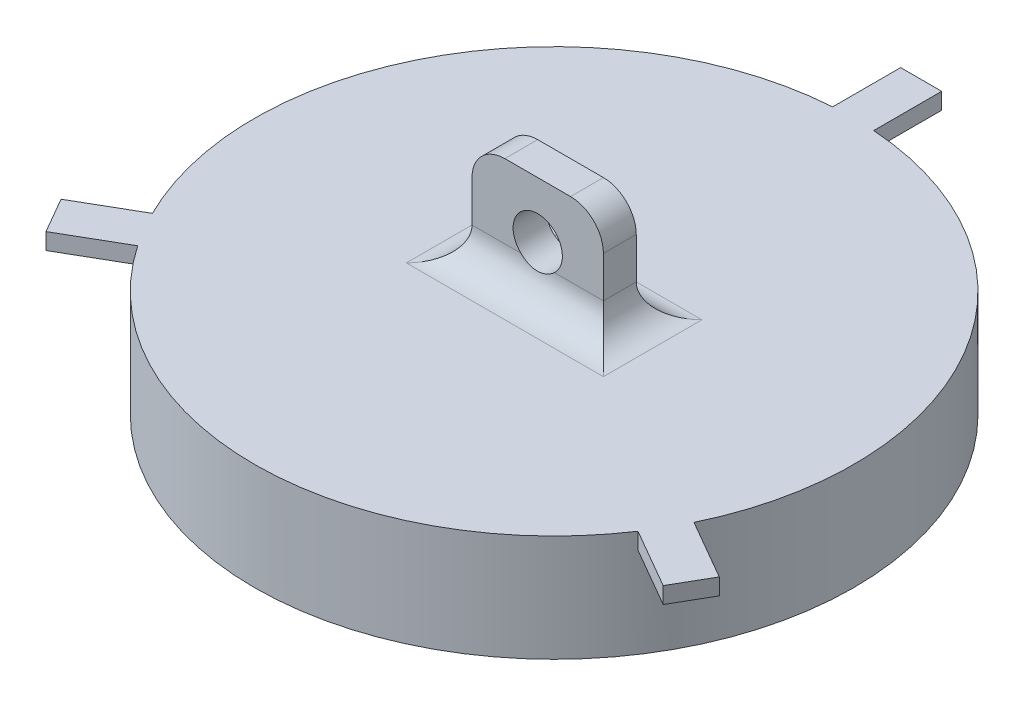
ISO-10303-21;
HEADER;
FILE_DESCRIPTION(('STEP AP214'),'2;1');
FILE_NAME('part.step','',(''),(''),'','','');
FILE_SCHEMA(('AUTOMOTIVE_DESIGN { 1 0 10303 214 1 1 1 1 }'));
ENDSEC;
DATA;
#1=APPLICATION_CONTEXT('core data for automotive mechanical design processes');
#2=APPLICATION_PROTOCOL_DEFINITION('international standard','automotive_design',2000,#1);
#3=PRODUCT_CONTEXT('',#1,'mechanical');
#4=PRODUCT('Part','Part','',(#3));
#5=PRODUCT_RELATED_PRODUCT_CATEGORY('part','',(#4));
#6=PRODUCT_DEFINITION_FORMATION('','',#4);
#7=PRODUCT_DEFINITION_CONTEXT('part definition',#1,'design');
#8=PRODUCT_DEFINITION('design','',#6,#7);
#9=PRODUCT_DEFINITION_SHAPE('','',#8);
#10=(LENGTH_UNIT() NAMED_UNIT(*) SI_UNIT(.MILLI.,.METRE.));
#11=(NAMED_UNIT(*) PLANE_ANGLE_UNIT() SI_UNIT($,.RADIAN.));
#12=(NAMED_UNIT(*) SI_UNIT($,.STERADIAN.) SOLID_ANGLE_UNIT());
#13=UNCERTAINTY_MEASURE_WITH_UNIT(LENGTH_MEASURE(1.E-05),#10,'distance_accuracy_value','');
#14=(GEOMETRIC_REPRESENTATION_CONTEXT(3) GLOBAL_UNCERTAINTY_ASSIGNED_CONTEXT((#13)) GLOBAL_UNIT_ASSIGNED_CONTEXT((#10,
#11,#12)) REPRESENTATION_CONTEXT('',''));
#15=CARTESIAN_POINT('',(0.,0.,0.));
#16=DIRECTION('',(0.,0.,1.));
#17=DIRECTION('',(1.,0.,0.));
#18=AXIS2_PLACEMENT_3D('',#15,#16,#17);
#19=CARTESIAN_POINT('',(0.,6.5,0.));
#20=DIRECTION('',(0.,-1.,0.));
#21=DIRECTION('',(0.,0.,-1.));
#22=AXIS2_PLACEMENT_3D('',#19,#20,#21);
#23=CYLINDRICAL_SURFACE('',#22,17.75);
#24=CARTESIAN_POINT('',(0.,0.,0.));
#25=DIRECTION('',(0.,1.,0.));
#26=DIRECTION('',(0.,0.,1.));
#27=AXIS2_PLACEMENT_3D('',#24,#25,#26);
#28=CIRCLE('',#27,17.75);
#29=CARTESIAN_POINT('',(0.,0.,-17.75));
#30=VERTEX_POINT('',#29);
#31=EDGE_CURVE('E350',#30,#30,#28,.T.);
#32=CARTESIAN_POINT('',(0.,5.,0.));
#33=DIRECTION('',(0.,1.,0.));
#34=DIRECTION('',(0.,0.,1.));
#35=AXIS2_PLACEMENT_3D('',#32,#33,#34);
#36=CIRCLE('',#35,17.75);
#37=CARTESIAN_POINT('',(0.,5.,-17.75));
#38=VERTEX_POINT('',#37);
#39=EDGE_CURVE('E347',#38,#38,#36,.T.);
#40=CARTESIAN_POINT('',(0.,0.,-17.75));
#41=CARTESIAN_POINT('',(0.,0.0520833333333334,-17.75));
#42=CARTESIAN_POINT('',(0.,0.104166666666667,-17.75));
#43=CARTESIAN_POINT('',(0.,0.208333333333334,-17.75));
#44=CARTESIAN_POINT('',(0.,0.260416666666667,-17.75));
#45=CARTESIAN_POINT('',(0.,0.364583333333333,-17.75));
#46=CARTESIAN_POINT('',(0.,0.416666666666666,-17.75));
#47=CARTESIAN_POINT('',(0.,0.520833333333333,-17.75));
#48=CARTESIAN_POINT('',(0.,0.572916666666666,-17.75));
#49=CARTESIAN_POINT('',(0.,0.677083333333333,-17.75));
#50=CARTESIAN_POINT('',(0.,0.729166666666667,-17.75));
#51=CARTESIAN_POINT('',(0.,0.833333333333333,-17.75));
#52=CARTESIAN_POINT('',(0.,0.885416666666667,-17.75));
#53=CARTESIAN_POINT('',(0.,0.989583333333333,-17.75));
#54=CARTESIAN_POINT('',(0.,1.04166666666667,-17.75));
#55=CARTESIAN_POINT('',(0.,1.14583333333333,-17.75));
#56=CARTESIAN_POINT('',(0.,1.19791666666667,-17.75));
#57=CARTESIAN_POINT('',(0.,1.30208333333333,-17.75));
#58=CARTESIAN_POINT('',(0.,1.35416666666667,-17.75));
#59=CARTESIAN_POINT('',(0.,1.45833333333333,-17.75));
#60=CARTESIAN_POINT('',(0.,1.51041666666667,-17.75));
#61=CARTESIAN_POINT('',(0.,1.61458333333333,-17.75));
#62=CARTESIAN_POINT('',(0.,1.66666666666667,-17.75));
#63=CARTESIAN_POINT('',(0.,1.77083333333333,-17.75));
#64=CARTESIAN_POINT('',(0.,1.82291666666667,-17.75));
#65=CARTESIAN_POINT('',(0.,1.92708333333333,-17.75));
#66=CARTESIAN_POINT('',(0.,1.97916666666667,-17.75));
#67=CARTESIAN_POINT('',(0.,2.08333333333333,-17.75));
#68=CARTESIAN_POINT('',(0.,2.13541666666667,-17.75));
#69=CARTESIAN_POINT('',(0.,2.23958333333333,-17.75));
#70=CARTESIAN_POINT('',(0.,2.29166666666667,-17.75));
#71=CARTESIAN_POINT('',(0.,2.39583333333333,-17.75));
#72=CARTESIAN_POINT('',(0.,2.44791666666667,-17.75));
#73=CARTESIAN_POINT('',(0.,2.55208333333333,-17.75));
#74=CARTESIAN_POINT('',(0.,2.60416666666667,-17.75));
#75=CARTESIAN_POINT('',(0.,2.70833333333333,-17.75));
#76=CARTESIAN_POINT('',(0.,2.76041666666667,-17.75));
#77=CARTESIAN_POINT('',(0.,2.86458333333333,-17.75));
#78=CARTESIAN_POINT('',(0.,2.91666666666667,-17.75));
#79=CARTESIAN_POINT('',(0.,3.02083333333333,-17.75));
#80=CARTESIAN_POINT('',(0.,3.07291666666667,-17.75));
#81=CARTESIAN_POINT('',(0.,3.17708333333333,-17.75));
#82=CARTESIAN_POINT('',(0.,3.22916666666667,-17.75));
#83=CARTESIAN_POINT('',(0.,3.33333333333333,-17.75));
#84=CARTESIAN_POINT('',(0.,3.38541666666667,-17.75));
#85=CARTESIAN_POINT('',(0.,3.48958333333333,-17.75));
#86=CARTESIAN_POINT('',(0.,3.54166666666667,-17.75));
#87=CARTESIAN_POINT('',(0.,3.64583333333333,-17.75));
#88=CARTESIAN_POINT('',(0.,3.69791666666667,-17.75));
#89=CARTESIAN_POINT('',(0.,3.80208333333333,-17.75));
#90=CARTESIAN_POINT('',(0.,3.85416666666667,-17.75));
#91=CARTESIAN_POINT('',(0.,3.95833333333333,-17.75));
#92=CARTESIAN_POINT('',(0.,4.01041666666667,-17.75));
#93=CARTESIAN_POINT('',(0.,4.11458333333333,-17.75));
#94=CARTESIAN_POINT('',(0.,4.16666666666667,-17.75));
#95=CARTESIAN_POINT('',(0.,4.27083333333333,-17.75));
#96=CARTESIAN_POINT('',(0.,4.32291666666667,-17.75));
#97=CARTESIAN_POINT('',(0.,4.42708333333333,-17.75));
#98=CARTESIAN_POINT('',(0.,4.47916666666667,-17.75));
#99=CARTESIAN_POINT('',(0.,4.58333333333333,-17.75));
#100=CARTESIAN_POINT('',(0.,4.63541666666667,-17.75));
#101=CARTESIAN_POINT('',(0.,4.73958333333333,-17.75));
#102=CARTESIAN_POINT('',(0.,4.79166666666666,-17.75));
#103=CARTESIAN_POINT('',(0.,4.89583333333333,-17.75));
#104=CARTESIAN_POINT('',(0.,4.94791666666666,-17.75));
#105=CARTESIAN_POINT('',(0.,5.,-17.75));
#106=B_SPLINE_CURVE_WITH_KNOTS('',3,(#40,#41,#42,#43,#44,#45,#46,#47,#48,#49,#50,#51,#52,#53,
#54,#55,#56,#57,#58,#59,#60,#61,#62,#63,#64,#65,#66,#67,#68,#69,#70,#71,#72,#73,#74,#75,#76,#77,
#78,#79,#80,#81,#82,#83,#84,#85,#86,#87,#88,#89,#90,#91,#92,#93,#94,#95,#96,#97,#98,#99,#100,
#101,#102,#103,#104,#105),.UNSPECIFIED.,.F.,.F.,(4,2,2,2,2,2,2,2,2,2,2,2,2,2,2,2,2,2,2,2,2,2,2,
2,2,2,2,2,2,2,2,2,4),(0.,0.15625,0.3125,0.46875,0.625,0.78125,0.9375,1.09375,1.25,1.40625,
1.5625,1.71875,1.875,2.03125,2.1875,2.34375,2.5,2.65625,2.8125,2.96875,3.125,3.28125,3.4375,
3.59375,3.75,3.90625,4.0625,4.21875,4.375,4.53125,4.6875,4.84375,5.),.UNSPECIFIED.);
#107=EDGE_CURVE('BSEAM35',#30,#38,#106,.T.);
#108=ORIENTED_EDGE('',*,*,#31,.F.);
#109=ORIENTED_EDGE('',*,*,#39,.T.);
#110=ORIENTED_EDGE('',*,*,#107,.T.);
#111=ORIENTED_EDGE('',*,*,#107,.F.);
#112=EDGE_LOOP('',(#108,#110,#109,#111));
#113=FACE_BOUND('',#112,.T.);
#114=ADVANCED_FACE('F35',(#113),#23,.F.);
#115=CARTESIAN_POINT('',(0.,6.5,0.));
#116=DIRECTION('',(0.,1.,0.));
#117=DIRECTION('',(0.,0.,1.));
#118=AXIS2_PLACEMENT_3D('',#115,#116,#117);
#119=PLANE('',#118);
#120=DIRECTION('',(-1.,0.,0.));
#121=VECTOR('',#120,1.);
#122=CARTESIAN_POINT('',(4.,6.5,-3.));
#123=LINE('',#122,#121);
#124=CARTESIAN_POINT('',(-6.,6.5,-3.));
#125=VERTEX_POINT('',#124);
#126=CARTESIAN_POINT('',(6.,6.5,-3.));
#127=VERTEX_POINT('',#126);
#128=EDGE_CURVE('E214',#125,#127,#123,.F.);
#129=ORIENTED_EDGE('',*,*,#128,.T.);
#130=DIRECTION('',(0.,0.,-1.));
#131=VECTOR('',#130,1.);
#132=CARTESIAN_POINT('',(6.,6.5,1.));
#133=LINE('',#132,#131);
#134=CARTESIAN_POINT('',(6.,6.5,3.));
#135=VERTEX_POINT('',#134);
#136=EDGE_CURVE('E210',#127,#135,#133,.F.);
#137=ORIENTED_EDGE('',*,*,#136,.T.);
#138=DIRECTION('',(1.,0.,0.));
#139=VECTOR('',#138,1.);
#140=CARTESIAN_POINT('',(-4.,6.5,3.));
#141=LINE('',#140,#139);
#142=CARTESIAN_POINT('',(-6.,6.5,3.));
#143=VERTEX_POINT('',#142);
#144=EDGE_CURVE('E310',#135,#143,#141,.F.);
#145=ORIENTED_EDGE('',*,*,#144,.T.);
#146=DIRECTION('',(0.,0.,1.));
#147=VECTOR('',#146,1.);
#148=CARTESIAN_POINT('',(-6.,6.5,-1.));
#149=LINE('',#148,#147);
#150=EDGE_CURVE('E314',#143,#125,#149,.F.);
#151=ORIENTED_EDGE('',*,*,#150,.T.);
#152=EDGE_LOOP('',(#129,#137,#145,#151));
#153=FACE_BOUND('',#152,.T.);
#154=CARTESIAN_POINT('',(0.,6.5,0.));
#155=DIRECTION('',(0.,1.,0.));
#156=DIRECTION('',(0.,0.,1.));
#157=AXIS2_PLACEMENT_3D('',#154,#155,#156);
#158=CIRCLE('',#157,18.25);
#159=CARTESIAN_POINT('',(-15.0829302689884,6.5,10.2746150536569));
#160=VERTEX_POINT('',#159);
#161=CARTESIAN_POINT('',(15.2022206040793,6.5,10.0972763013055));
#162=VERTEX_POINT('',#161);
#163=EDGE_CURVE('E358',#160,#162,#158,.T.);
#164=ORIENTED_EDGE('',*,*,#163,.T.);
#165=DIRECTION('',(-0.866025403784438,0.,-0.5));
#166=VECTOR('',#165,1.);
#167=CARTESIAN_POINT('',(18.8360114885325,6.5,12.1952464466233));
#168=LINE('',#167,#166);
#169=CARTESIAN_POINT('',(18.8360114885325,6.5,12.1952464466233));
#170=VERTEX_POINT('',#169);
#171=EDGE_CURVE('E404',#170,#162,#168,.T.);
#172=ORIENTED_EDGE('',*,*,#171,.F.);
#173=DIRECTION('',(-0.499999999999998,0.,0.86602540378444));
#174=VECTOR('',#173,1.);
#175=CARTESIAN_POINT('',(20.0860114885325,6.5,10.0301829371622));
#176=LINE('',#175,#174);
#177=CARTESIAN_POINT('',(20.0860114885325,6.5,10.0301829371622));
#178=VERTEX_POINT('',#177);
#179=EDGE_CURVE('E416',#178,#170,#176,.T.);
#180=ORIENTED_EDGE('',*,*,#179,.F.);
#181=DIRECTION('',(0.866025403784438,0.,0.500000000000001));
#182=VECTOR('',#181,1.);
#183=CARTESIAN_POINT('',(20.0860114885325,6.5,10.0301829371622));
#184=LINE('',#183,#182);
#185=CARTESIAN_POINT('',(16.439542785067,6.5,7.92489324962491));
#186=VERTEX_POINT('',#185);
#187=EDGE_CURVE('E408',#186,#178,#184,.T.);
#188=ORIENTED_EDGE('',*,*,#187,.F.);
#189=CARTESIAN_POINT('',(1.25,6.5,-18.2071414560331));
#190=VERTEX_POINT('',#189);
#191=EDGE_CURVE('E355',#186,#190,#158,.T.);
#192=ORIENTED_EDGE('',*,*,#191,.T.);
#193=DIRECTION('',(0.,0.,1.));
#194=VECTOR('',#193,1.);
#195=CARTESIAN_POINT('',(1.25,6.5,-22.3485349134992));
#196=LINE('',#195,#194);
#197=CARTESIAN_POINT('',(1.25,6.5,-22.3485349134992));
#198=VERTEX_POINT('',#197);
#199=EDGE_CURVE('E369',#198,#190,#196,.T.);
#200=ORIENTED_EDGE('',*,*,#199,.F.);
#201=DIRECTION('',(1.,0.,0.));
#202=VECTOR('',#201,1.);
#203=CARTESIAN_POINT('',(-1.25,6.5,-22.3485349134992));
#204=LINE('',#203,#202);
#205=CARTESIAN_POINT('',(-1.25,6.5,-22.3485349134992));
#206=VERTEX_POINT('',#205);
#207=EDGE_CURVE('E364',#206,#198,#204,.T.);
#208=ORIENTED_EDGE('',*,*,#207,.F.);
#209=DIRECTION('',(0.,0.,-1.));
#210=VECTOR('',#209,1.);
#211=CARTESIAN_POINT('',(-1.25,6.5,-22.3485349134992));
#212=LINE('',#211,#210);
#213=CARTESIAN_POINT('',(-1.25,6.5,-18.2071414560331));
#214=VERTEX_POINT('',#213);
#215=EDGE_CURVE('E378',#214,#206,#212,.T.);
#216=ORIENTED_EDGE('',*,*,#215,.F.);
#217=CARTESIAN_POINT('',(-16.3456080880007,6.5,8.11687108641534));
#218=VERTEX_POINT('',#217);
#219=EDGE_CURVE('E346',#214,#218,#158,.T.);
#220=ORIENTED_EDGE('',*,*,#219,.T.);
#221=DIRECTION('',(0.866025403784439,0.,-0.5));
#222=VECTOR('',#221,1.);
#223=CARTESIAN_POINT('',(-19.8727864563752,6.5,10.1532884668762));
#224=LINE('',#223,#222);
#225=CARTESIAN_POINT('',(-19.8727864563752,6.5,10.1532884668762));
#226=VERTEX_POINT('',#225);
#227=EDGE_CURVE('E385',#226,#218,#224,.T.);
#228=ORIENTED_EDGE('',*,*,#227,.F.);
#229=DIRECTION('',(-0.500000000000001,0.,-0.866025403784438));
#230=VECTOR('',#229,1.);
#231=CARTESIAN_POINT('',(-18.6227864563752,6.5,12.3183519763373));
#232=LINE('',#231,#230);
#233=CARTESIAN_POINT('',(-18.6227864563752,6.5,12.3183519763373));
#234=VERTEX_POINT('',#233);
#235=EDGE_CURVE('E397',#234,#226,#232,.T.);
#236=ORIENTED_EDGE('',*,*,#235,.F.);
#237=DIRECTION('',(-0.866025403784439,0.,0.5));
#238=VECTOR('',#237,1.);
#239=CARTESIAN_POINT('',(-18.6227864563752,6.5,12.3183519763373));
#240=LINE('',#239,#238);
#241=EDGE_CURVE('E389',#160,#234,#240,.T.);
#242=ORIENTED_EDGE('',*,*,#241,.F.);
#243=EDGE_LOOP('',(#164,#172,#180,#188,#192,#200,#208,#216,#220,#228,#236,#242));
#244=FACE_BOUND('',#243,.T.);
#245=ADVANCED_FACE('F276',(#153,#244),#119,.T.);
#246=CARTESIAN_POINT('',(0.,0.,0.));
#247=DIRECTION('',(0.,1.,0.));
#248=DIRECTION('',(0.,0.,1.));
#249=AXIS2_PLACEMENT_3D('',#246,#247,#248);
#250=PLANE('',#249);
#251=CARTESIAN_POINT('',(0.,0.,0.));
#252=DIRECTION('',(0.,1.,0.));
#253=DIRECTION('',(0.,0.,1.));
#254=AXIS2_PLACEMENT_3D('',#251,#252,#253);
#255=CIRCLE('',#254,18.25);
#256=CARTESIAN_POINT('',(0.,0.,18.25));
#257=VERTEX_POINT('',#256);
#258=EDGE_CURVE('E352',#257,#257,#255,.T.);
#259=ORIENTED_EDGE('',*,*,#258,.F.);
#260=EDGE_LOOP('',(#259));
#261=FACE_BOUND('',#260,.T.);
#262=ORIENTED_EDGE('',*,*,#31,.T.);
#263=EDGE_LOOP('',(#262));
#264=FACE_BOUND('',#263,.T.);
#265=ADVANCED_FACE('F282',(#261,#264),#250,.F.);
#266=CARTESIAN_POINT('',(0.,6.5,0.));
#267=DIRECTION('',(0.,-1.,0.));
#268=DIRECTION('',(0.,0.,-1.));
#269=AXIS2_PLACEMENT_3D('',#266,#267,#268);
#270=CYLINDRICAL_SURFACE('',#269,18.25);
#271=CARTESIAN_POINT('',(0.,5.5,0.));
#272=DIRECTION('',(0.,-1.,0.));
#273=DIRECTION('',(0.,0.,-1.));
#274=AXIS2_PLACEMENT_3D('',#271,#272,#273);
#275=CIRCLE('',#274,18.25);
#276=CARTESIAN_POINT('',(16.439542785067,5.5,7.92489324962491));
#277=VERTEX_POINT('',#276);
#278=CARTESIAN_POINT('',(15.2022206040793,5.5,10.0972763013055));
#279=VERTEX_POINT('',#278);
#280=EDGE_CURVE('E326',#277,#279,#275,.T.);
#281=ORIENTED_EDGE('',*,*,#280,.T.);
#282=DIRECTION('',(0.,-1.,0.));
#283=VECTOR('',#282,1.);
#284=CARTESIAN_POINT('',(15.2022206040793,6.5,10.0972763013055));
#285=LINE('',#284,#283);
#286=EDGE_CURVE('E320',#279,#162,#285,.F.);
#287=ORIENTED_EDGE('',*,*,#286,.T.);
#288=ORIENTED_EDGE('',*,*,#163,.F.);
#289=DIRECTION('',(0.,-1.,0.));
#290=VECTOR('',#289,1.);
#291=CARTESIAN_POINT('',(-15.0829302689884,6.5,10.2746150536569));
#292=LINE('',#291,#290);
#293=CARTESIAN_POINT('',(-15.0829302689884,5.5,10.2746150536569));
#294=VERTEX_POINT('',#293);
#295=EDGE_CURVE('E332',#160,#294,#292,.T.);
#296=ORIENTED_EDGE('',*,*,#295,.T.);
#297=CARTESIAN_POINT('',(0.,5.5,0.));
#298=DIRECTION('',(0.,-1.,0.));
#299=DIRECTION('',(0.,0.,-1.));
#300=AXIS2_PLACEMENT_3D('',#297,#298,#299);
#301=CIRCLE('',#300,18.25);
#302=CARTESIAN_POINT('',(-16.3456080880007,5.5,8.11687108641534));
#303=VERTEX_POINT('',#302);
#304=EDGE_CURVE('E335',#294,#303,#301,.T.);
#305=ORIENTED_EDGE('',*,*,#304,.T.);
#306=DIRECTION('',(0.,-1.,0.));
#307=VECTOR('',#306,1.);
#308=CARTESIAN_POINT('',(-16.3456080880007,6.5,8.11687108641533));
#309=LINE('',#308,#307);
#310=EDGE_CURVE('E329',#303,#218,#309,.F.);
#311=ORIENTED_EDGE('',*,*,#310,.T.);
#312=ORIENTED_EDGE('',*,*,#219,.F.);
#313=DIRECTION('',(0.,-1.,0.));
#314=VECTOR('',#313,1.);
#315=CARTESIAN_POINT('',(-1.25,6.5,-18.2071414560331));
#316=LINE('',#315,#314);
#317=CARTESIAN_POINT('',(-1.25,5.5,-18.2071414560331));
#318=VERTEX_POINT('',#317);
#319=EDGE_CURVE('E341',#214,#318,#316,.T.);
#320=ORIENTED_EDGE('',*,*,#319,.T.);
#321=CARTESIAN_POINT('',(0.,5.5,0.));
#322=DIRECTION('',(0.,1.,0.));
#323=DIRECTION('',(0.,0.,1.));
#324=AXIS2_PLACEMENT_3D('',#321,#322,#323);
#325=CIRCLE('',#324,18.25);
#326=CARTESIAN_POINT('',(1.25,5.5,-18.2071414560331));
#327=VERTEX_POINT('',#326);
#328=EDGE_CURVE('E343',#327,#318,#325,.T.);
#329=ORIENTED_EDGE('',*,*,#328,.F.);
#330=DIRECTION('',(0.,-1.,0.));
#331=VECTOR('',#330,1.);
#332=CARTESIAN_POINT('',(1.25,6.5,-18.2071414560331));
#333=LINE('',#332,#331);
#334=EDGE_CURVE('E338',#327,#190,#333,.F.);
#335=ORIENTED_EDGE('',*,*,#334,.T.);
#336=ORIENTED_EDGE('',*,*,#191,.F.);
#337=DIRECTION('',(0.,-1.,0.));
#338=VECTOR('',#337,1.);
#339=CARTESIAN_POINT('',(16.439542785067,6.5,7.92489324962491));
#340=LINE('',#339,#338);
#341=EDGE_CURVE('E323',#186,#277,#340,.T.);
#342=ORIENTED_EDGE('',*,*,#341,.T.);
#343=EDGE_LOOP('',(#281,#287,#288,#296,#305,#311,#312,#320,#329,#335,#336,#342));
#344=FACE_BOUND('',#343,.T.);
#345=ORIENTED_EDGE('',*,*,#258,.T.);
#346=EDGE_LOOP('',(#345));
#347=FACE_BOUND('',#346,.T.);
#348=ADVANCED_FACE('F293',(#344,#347),#270,.T.);
#349=CARTESIAN_POINT('',(0.,5.,0.));
#350=DIRECTION('',(0.,1.,0.));
#351=DIRECTION('',(0.,0.,1.));
#352=AXIS2_PLACEMENT_3D('',#349,#350,#351);
#353=PLANE('',#352);
#354=ORIENTED_EDGE('',*,*,#39,.F.);
#355=EDGE_LOOP('',(#354));
#356=FACE_BOUND('',#355,.T.);
#357=ADVANCED_FACE('F288',(#356),#353,.F.);
#358=CARTESIAN_POINT('',(1.25,6.5,-22.3485349134992));
#359=DIRECTION('',(1.,0.,0.));
#360=DIRECTION('',(0.,0.,-1.));
#361=AXIS2_PLACEMENT_3D('',#358,#359,#360);
#362=PLANE('',#361);
#363=ORIENTED_EDGE('',*,*,#334,.F.);
#364=DIRECTION('',(0.,0.,1.));
#365=VECTOR('',#364,1.);
#366=CARTESIAN_POINT('',(1.25,5.5,-22.3485349134992));
#367=LINE('',#366,#365);
#368=CARTESIAN_POINT('',(1.25,5.5,-22.3485349134992));
#369=VERTEX_POINT('',#368);
#370=EDGE_CURVE('E372',#369,#327,#367,.T.);
#371=ORIENTED_EDGE('',*,*,#370,.F.);
#372=DIRECTION('',(0.,-1.,0.));
#373=VECTOR('',#372,1.);
#374=CARTESIAN_POINT('',(1.25,6.5,-22.3485349134992));
#375=LINE('',#374,#373);
#376=EDGE_CURVE('E351',#198,#369,#375,.T.);
#377=ORIENTED_EDGE('',*,*,#376,.F.);
#378=ORIENTED_EDGE('',*,*,#199,.T.);
#379=EDGE_LOOP('',(#363,#371,#377,#378));
#380=FACE_BOUND('',#379,.T.);
#381=ADVANCED_FACE('F504',(#380),#362,.T.);
#382=CARTESIAN_POINT('',(-1.25,6.5,-22.3485349134992));
#383=DIRECTION('',(-1.,0.,0.));
#384=DIRECTION('',(0.,0.,1.));
#385=AXIS2_PLACEMENT_3D('',#382,#383,#384);
#386=PLANE('',#385);
#387=ORIENTED_EDGE('',*,*,#319,.F.);
#388=ORIENTED_EDGE('',*,*,#215,.T.);
#389=DIRECTION('',(0.,-1.,0.));
#390=VECTOR('',#389,1.);
#391=CARTESIAN_POINT('',(-1.25,6.5,-22.3485349134992));
#392=LINE('',#391,#390);
#393=CARTESIAN_POINT('',(-1.25,5.5,-22.3485349134992));
#394=VERTEX_POINT('',#393);
#395=EDGE_CURVE('E361',#206,#394,#392,.T.);
#396=ORIENTED_EDGE('',*,*,#395,.T.);
#397=DIRECTION('',(0.,0.,-1.));
#398=VECTOR('',#397,1.);
#399=CARTESIAN_POINT('',(-1.25,5.5,-22.3485349134992));
#400=LINE('',#399,#398);
#401=EDGE_CURVE('E370',#318,#394,#400,.T.);
#402=ORIENTED_EDGE('',*,*,#401,.F.);
#403=EDGE_LOOP('',(#387,#388,#396,#402));
#404=FACE_BOUND('',#403,.T.);
#405=ADVANCED_FACE('F501',(#404),#386,.T.);
#406=CARTESIAN_POINT('',(-1.25,6.5,-22.3485349134992));
#407=DIRECTION('',(0.,0.,-1.));
#408=DIRECTION('',(-1.,0.,0.));
#409=AXIS2_PLACEMENT_3D('',#406,#407,#408);
#410=PLANE('',#409);
#411=DIRECTION('',(1.,0.,0.));
#412=VECTOR('',#411,1.);
#413=CARTESIAN_POINT('',(-1.25,5.5,-22.3485349134992));
#414=LINE('',#413,#412);
#415=EDGE_CURVE('E366',#394,#369,#414,.T.);
#416=ORIENTED_EDGE('',*,*,#415,.F.);
#417=ORIENTED_EDGE('',*,*,#395,.F.);
#418=ORIENTED_EDGE('',*,*,#207,.T.);
#419=ORIENTED_EDGE('',*,*,#376,.T.);
#420=EDGE_LOOP('',(#416,#417,#418,#419));
#421=FACE_BOUND('',#420,.T.);
#422=ADVANCED_FACE('F497',(#421),#410,.T.);
#423=CARTESIAN_POINT('',(0.,5.5,0.));
#424=DIRECTION('',(0.,1.,0.));
#425=DIRECTION('',(0.,0.,1.));
#426=AXIS2_PLACEMENT_3D('',#423,#424,#425);
#427=PLANE('',#426);
#428=ORIENTED_EDGE('',*,*,#370,.T.);
#429=ORIENTED_EDGE('',*,*,#328,.T.);
#430=ORIENTED_EDGE('',*,*,#401,.T.);
#431=ORIENTED_EDGE('',*,*,#415,.T.);
#432=EDGE_LOOP('',(#428,#429,#430,#431));
#433=FACE_BOUND('',#432,.T.);
#434=ADVANCED_FACE('F487',(#433),#427,.F.);
#435=CARTESIAN_POINT('',(-19.8727864563752,6.5,10.1532884668762));
#436=DIRECTION('',(-0.5,0.,-0.866025403784439));
#437=DIRECTION('',(-0.866025403784439,0.,0.5));
#438=AXIS2_PLACEMENT_3D('',#435,#436,#437);
#439=PLANE('',#438);
#440=ORIENTED_EDGE('',*,*,#310,.F.);
#441=DIRECTION('',(0.866025403784439,0.,-0.5));
#442=VECTOR('',#441,1.);
#443=CARTESIAN_POINT('',(-19.8727864563752,5.5,10.1532884668762));
#444=LINE('',#443,#442);
#445=CARTESIAN_POINT('',(-19.8727864563752,5.5,10.1532884668762));
#446=VERTEX_POINT('',#445);
#447=EDGE_CURVE('E387',#446,#303,#444,.T.);
#448=ORIENTED_EDGE('',*,*,#447,.F.);
#449=DIRECTION('',(0.,-1.,0.));
#450=VECTOR('',#449,1.);
#451=CARTESIAN_POINT('',(-19.8727864563752,6.5,10.1532884668762));
#452=LINE('',#451,#450);
#453=EDGE_CURVE('E375',#226,#446,#452,.T.);
#454=ORIENTED_EDGE('',*,*,#453,.F.);
#455=ORIENTED_EDGE('',*,*,#227,.T.);
#456=EDGE_LOOP('',(#440,#448,#454,#455));
#457=FACE_BOUND('',#456,.T.);
#458=ADVANCED_FACE('F483',(#457),#439,.T.);
#459=CARTESIAN_POINT('',(-18.6227864563752,6.5,12.3183519763373));
#460=DIRECTION('',(0.5,0.,0.866025403784439));
#461=DIRECTION('',(0.866025403784439,0.,-0.5));
#462=AXIS2_PLACEMENT_3D('',#459,#460,#461);
#463=PLANE('',#462);
#464=ORIENTED_EDGE('',*,*,#295,.F.);
#465=ORIENTED_EDGE('',*,*,#241,.T.);
#466=DIRECTION('',(0.,-1.,0.));
#467=VECTOR('',#466,1.);
#468=CARTESIAN_POINT('',(-18.6227864563752,6.5,12.3183519763373));
#469=LINE('',#468,#467);
#470=CARTESIAN_POINT('',(-18.6227864563752,5.5,12.3183519763373));
#471=VERTEX_POINT('',#470);
#472=EDGE_CURVE('E382',#234,#471,#469,.T.);
#473=ORIENTED_EDGE('',*,*,#472,.T.);
#474=DIRECTION('',(-0.866025403784439,0.,0.5));
#475=VECTOR('',#474,1.);
#476=CARTESIAN_POINT('',(-18.6227864563752,5.5,12.3183519763373));
#477=LINE('',#476,#475);
#478=EDGE_CURVE('E393',#294,#471,#477,.T.);
#479=ORIENTED_EDGE('',*,*,#478,.F.);
#480=EDGE_LOOP('',(#464,#465,#473,#479));
#481=FACE_BOUND('',#480,.T.);
#482=ADVANCED_FACE('F486',(#481),#463,.T.);
#483=CARTESIAN_POINT('',(-18.6227864563752,6.5,12.3183519763373));
#484=DIRECTION('',(-0.866025403784438,0.,0.500000000000001));
#485=DIRECTION('',(0.500000000000001,0.,0.866025403784438));
#486=AXIS2_PLACEMENT_3D('',#483,#484,#485);
#487=PLANE('',#486);
#488=DIRECTION('',(-0.500000000000001,0.,-0.866025403784438));
#489=VECTOR('',#488,1.);
#490=CARTESIAN_POINT('',(-18.6227864563752,5.5,12.3183519763373));
#491=LINE('',#490,#489);
#492=EDGE_CURVE('E390',#471,#446,#491,.T.);
#493=ORIENTED_EDGE('',*,*,#492,.F.);
#494=ORIENTED_EDGE('',*,*,#472,.F.);
#495=ORIENTED_EDGE('',*,*,#235,.T.);
#496=ORIENTED_EDGE('',*,*,#453,.T.);
#497=EDGE_LOOP('',(#493,#494,#495,#496));
#498=FACE_BOUND('',#497,.T.);
#499=ADVANCED_FACE('F481',(#498),#487,.T.);
#500=CARTESIAN_POINT('',(0.,5.5,0.));
#501=DIRECTION('',(0.,-1.,0.));
#502=DIRECTION('',(0.,0.,-1.));
#503=AXIS2_PLACEMENT_3D('',#500,#501,#502);
#504=PLANE('',#503);
#505=ORIENTED_EDGE('',*,*,#304,.F.);
#506=ORIENTED_EDGE('',*,*,#478,.T.);
#507=ORIENTED_EDGE('',*,*,#492,.T.);
#508=ORIENTED_EDGE('',*,*,#447,.T.);
#509=EDGE_LOOP('',(#505,#506,#507,#508));
#510=FACE_BOUND('',#509,.T.);
#511=ADVANCED_FACE('F471',(#510),#504,.T.);
#512=CARTESIAN_POINT('',(18.8360114885325,6.5,12.1952464466233));
#513=DIRECTION('',(-0.5,0.,0.866025403784439));
#514=DIRECTION('',(0.866025403784438,0.,0.5));
#515=AXIS2_PLACEMENT_3D('',#512,#513,#514);
#516=PLANE('',#515);
#517=ORIENTED_EDGE('',*,*,#286,.F.);
#518=DIRECTION('',(-0.866025403784438,0.,-0.5));
#519=VECTOR('',#518,1.);
#520=CARTESIAN_POINT('',(18.8360114885325,5.5,12.1952464466233));
#521=LINE('',#520,#519);
#522=CARTESIAN_POINT('',(18.8360114885325,5.5,12.1952464466233));
#523=VERTEX_POINT('',#522);
#524=EDGE_CURVE('E406',#523,#279,#521,.T.);
#525=ORIENTED_EDGE('',*,*,#524,.F.);
#526=DIRECTION('',(0.,-1.,0.));
#527=VECTOR('',#526,1.);
#528=CARTESIAN_POINT('',(18.8360114885325,6.5,12.1952464466233));
#529=LINE('',#528,#527);
#530=EDGE_CURVE('E395',#170,#523,#529,.T.);
#531=ORIENTED_EDGE('',*,*,#530,.F.);
#532=ORIENTED_EDGE('',*,*,#171,.T.);
#533=EDGE_LOOP('',(#517,#525,#531,#532));
#534=FACE_BOUND('',#533,.T.);
#535=ADVANCED_FACE('F467',(#534),#516,.T.);
#536=CARTESIAN_POINT('',(20.0860114885325,6.5,10.0301829371622));
#537=DIRECTION('',(0.500000000000001,0.,-0.866025403784438));
#538=DIRECTION('',(-0.866025403784438,0.,-0.500000000000001));
#539=AXIS2_PLACEMENT_3D('',#536,#537,#538);
#540=PLANE('',#539);
#541=ORIENTED_EDGE('',*,*,#341,.F.);
#542=ORIENTED_EDGE('',*,*,#187,.T.);
#543=DIRECTION('',(0.,-1.,0.));
#544=VECTOR('',#543,1.);
#545=CARTESIAN_POINT('',(20.0860114885325,6.5,10.0301829371622));
#546=LINE('',#545,#544);
#547=CARTESIAN_POINT('',(20.0860114885325,5.5,10.0301829371622));
#548=VERTEX_POINT('',#547);
#549=EDGE_CURVE('E401',#178,#548,#546,.T.);
#550=ORIENTED_EDGE('',*,*,#549,.T.);
#551=DIRECTION('',(0.866025403784438,0.,0.500000000000001));
#552=VECTOR('',#551,1.);
#553=CARTESIAN_POINT('',(20.0860114885325,5.5,10.0301829371622));
#554=LINE('',#553,#552);
#555=EDGE_CURVE('E412',#277,#548,#554,.T.);
#556=ORIENTED_EDGE('',*,*,#555,.F.);
#557=EDGE_LOOP('',(#541,#542,#550,#556));
#558=FACE_BOUND('',#557,.T.);
#559=ADVANCED_FACE('F470',(#558),#540,.T.);
#560=CARTESIAN_POINT('',(20.0860114885325,6.5,10.0301829371622));
#561=DIRECTION('',(0.86602540378444,0.,0.499999999999998));
#562=DIRECTION('',(0.499999999999998,0.,-0.86602540378444));
#563=AXIS2_PLACEMENT_3D('',#560,#561,#562);
#564=PLANE('',#563);
#565=DIRECTION('',(-0.499999999999998,0.,0.86602540378444));
#566=VECTOR('',#565,1.);
#567=CARTESIAN_POINT('',(20.0860114885325,5.5,10.0301829371622));
#568=LINE('',#567,#566);
#569=EDGE_CURVE('E409',#548,#523,#568,.T.);
#570=ORIENTED_EDGE('',*,*,#569,.F.);
#571=ORIENTED_EDGE('',*,*,#549,.F.);
#572=ORIENTED_EDGE('',*,*,#179,.T.);
#573=ORIENTED_EDGE('',*,*,#530,.T.);
#574=EDGE_LOOP('',(#570,#571,#572,#573));
#575=FACE_BOUND('',#574,.T.);
#576=ADVANCED_FACE('F465',(#575),#564,.T.);
#577=CARTESIAN_POINT('',(0.,5.5,0.));
#578=DIRECTION('',(0.,-1.,0.));
#579=DIRECTION('',(0.,0.,-1.));
#580=AXIS2_PLACEMENT_3D('',#577,#578,#579);
#581=PLANE('',#580);
#582=ORIENTED_EDGE('',*,*,#280,.F.);
#583=ORIENTED_EDGE('',*,*,#555,.T.);
#584=ORIENTED_EDGE('',*,*,#569,.T.);
#585=ORIENTED_EDGE('',*,*,#524,.T.);
#586=EDGE_LOOP('',(#582,#583,#584,#585));
#587=FACE_BOUND('',#586,.T.);
#588=ADVANCED_FACE('F462',(#587),#581,.T.);
#589=CARTESIAN_POINT('',(-4.,13.,-1.));
#590=DIRECTION('',(-1.,0.,0.));
#591=DIRECTION('',(0.,0.,1.));
#592=AXIS2_PLACEMENT_3D('',#589,#590,#591);
#593=PLANE('',#592);
#594=DIRECTION('',(0.,-1.,0.));
#595=VECTOR('',#594,1.);
#596=CARTESIAN_POINT('',(-4.,13.,1.));
#597=LINE('',#596,#595);
#598=CARTESIAN_POINT('',(-4.,11.,1.));
#599=VERTEX_POINT('',#598);
#600=CARTESIAN_POINT('',(-4.,8.5,1.));
#601=VERTEX_POINT('',#600);
#602=EDGE_CURVE('E414',#599,#601,#597,.T.);
#603=ORIENTED_EDGE('',*,*,#602,.F.);
#604=DIRECTION('',(0.,0.,-1.));
#605=VECTOR('',#604,1.);
#606=CARTESIAN_POINT('',(-4.,11.,-1.));
#607=LINE('',#606,#605);
#608=CARTESIAN_POINT('',(-4.,11.,-1.));
#609=VERTEX_POINT('',#608);
#610=EDGE_CURVE('E11',#599,#609,#607,.T.);
#611=ORIENTED_EDGE('',*,*,#610,.T.);
#612=DIRECTION('',(0.,-1.,0.));
#613=VECTOR('',#612,1.);
#614=CARTESIAN_POINT('',(-4.,13.,-1.));
#615=LINE('',#614,#613);
#616=CARTESIAN_POINT('',(-4.,8.5,-1.));
#617=VERTEX_POINT('',#616);
#618=EDGE_CURVE('E420',#609,#617,#615,.T.);
#619=ORIENTED_EDGE('',*,*,#618,.T.);
#620=DIRECTION('',(0.,0.,1.));
#621=VECTOR('',#620,1.);
#622=CARTESIAN_POINT('',(-4.,8.5,1.));
#623=LINE('',#622,#621);
#624=EDGE_CURVE('E212',#617,#601,#623,.T.);
#625=ORIENTED_EDGE('',*,*,#624,.T.);
#626=EDGE_LOOP('',(#603,#611,#619,#625));
#627=FACE_BOUND('',#626,.T.);
#628=ADVANCED_FACE('F449',(#627),#593,.T.);
#629=CARTESIAN_POINT('',(4.,13.,1.));
#630=DIRECTION('',(0.,0.,1.));
#631=DIRECTION('',(1.,0.,0.));
#632=AXIS2_PLACEMENT_3D('',#629,#630,#631);
#633=PLANE('',#632);
#634=DIRECTION('',(0.,-1.,0.));
#635=VECTOR('',#634,1.);
#636=CARTESIAN_POINT('',(4.,13.,1.));
#637=LINE('',#636,#635);
#638=CARTESIAN_POINT('',(4.,11.,1.));
#639=VERTEX_POINT('',#638);
#640=CARTESIAN_POINT('',(4.,8.5,1.));
#641=VERTEX_POINT('',#640);
#642=EDGE_CURVE('E425',#639,#641,#637,.T.);
#643=ORIENTED_EDGE('',*,*,#642,.F.);
#644=CARTESIAN_POINT('',(2.,11.,1.));
#645=DIRECTION('',(0.,0.,1.));
#646=DIRECTION('',(1.,0.,0.));
#647=AXIS2_PLACEMENT_3D('',#644,#645,#646);
#648=CIRCLE('',#647,2.);
#649=CARTESIAN_POINT('',(2.,13.,1.));
#650=VERTEX_POINT('',#649);
#651=EDGE_CURVE('E437',#639,#650,#648,.T.);
#652=ORIENTED_EDGE('',*,*,#651,.T.);
#653=DIRECTION('',(-1.,0.,0.));
#654=VECTOR('',#653,1.);
#655=CARTESIAN_POINT('',(4.,13.,1.));
#656=LINE('',#655,#654);
#657=CARTESIAN_POINT('',(-2.,13.,1.));
#658=VERTEX_POINT('',#657);
#659=EDGE_CURVE('E423',#650,#658,#656,.T.);
#660=ORIENTED_EDGE('',*,*,#659,.T.);
#661=CARTESIAN_POINT('',(-2.,11.,1.));
#662=DIRECTION('',(0.,0.,1.));
#663=DIRECTION('',(1.,0.,0.));
#664=AXIS2_PLACEMENT_3D('',#661,#662,#663);
#665=CIRCLE('',#664,2.);
#666=EDGE_CURVE('E438',#658,#599,#665,.T.);
#667=ORIENTED_EDGE('',*,*,#666,.T.);
#668=ORIENTED_EDGE('',*,*,#602,.T.);
#669=DIRECTION('',(1.,0.,0.));
#670=VECTOR('',#669,1.);
#671=CARTESIAN_POINT('',(4.,8.5,1.));
#672=LINE('',#671,#670);
#673=CARTESIAN_POINT('',(-1.02221114859279,8.5,1.));
#674=VERTEX_POINT('',#673);
#675=EDGE_CURVE('E194',#601,#674,#672,.T.);
#676=ORIENTED_EDGE('',*,*,#675,.T.);
#677=CARTESIAN_POINT('',(0.,9.59776334776335,1.));
#678=DIRECTION('',(0.,0.,1.));
#679=DIRECTION('',(1.,0.,0.));
#680=AXIS2_PLACEMENT_3D('',#677,#678,#679);
#681=CIRCLE('',#680,1.5);
#682=CARTESIAN_POINT('',(1.02221114859279,8.5,1.));
#683=VERTEX_POINT('',#682);
#684=EDGE_CURVE('E227',#683,#674,#681,.T.);
#685=ORIENTED_EDGE('',*,*,#684,.F.);
#686=EDGE_CURVE('E220',#683,#641,#672,.T.);
#687=ORIENTED_EDGE('',*,*,#686,.T.);
#688=EDGE_LOOP('',(#643,#652,#660,#667,#668,#676,#685,#687));
#689=FACE_BOUND('',#688,.T.);
#690=ADVANCED_FACE('F446',(#689),#633,.T.);
#691=CARTESIAN_POINT('',(4.,13.,-1.));
#692=DIRECTION('',(1.,0.,0.));
#693=DIRECTION('',(0.,0.,-1.));
#694=AXIS2_PLACEMENT_3D('',#691,#692,#693);
#695=PLANE('',#694);
#696=DIRECTION('',(0.,-1.,0.));
#697=VECTOR('',#696,1.);
#698=CARTESIAN_POINT('',(4.,13.,-1.));
#699=LINE('',#698,#697);
#700=CARTESIAN_POINT('',(4.,11.,-1.));
#701=VERTEX_POINT('',#700);
#702=CARTESIAN_POINT('',(4.,8.5,-1.));
#703=VERTEX_POINT('',#702);
#704=EDGE_CURVE('E422',#701,#703,#699,.T.);
#705=ORIENTED_EDGE('',*,*,#704,.F.);
#706=DIRECTION('',(0.,0.,1.));
#707=VECTOR('',#706,1.);
#708=CARTESIAN_POINT('',(4.,11.,1.));
#709=LINE('',#708,#707);
#710=EDGE_CURVE('E193',#701,#639,#709,.T.);
#711=ORIENTED_EDGE('',*,*,#710,.T.);
#712=ORIENTED_EDGE('',*,*,#642,.T.);
#713=DIRECTION('',(0.,0.,-1.));
#714=VECTOR('',#713,1.);
#715=CARTESIAN_POINT('',(4.,8.5,-1.));
#716=LINE('',#715,#714);
#717=EDGE_CURVE('E308',#641,#703,#716,.T.);
#718=ORIENTED_EDGE('',*,*,#717,.T.);
#719=EDGE_LOOP('',(#705,#711,#712,#718));
#720=FACE_BOUND('',#719,.T.);
#721=ADVANCED_FACE('F444',(#720),#695,.T.);
#722=CARTESIAN_POINT('',(4.,13.,-1.));
#723=DIRECTION('',(0.,0.,-1.));
#724=DIRECTION('',(-1.,0.,0.));
#725=AXIS2_PLACEMENT_3D('',#722,#723,#724);
#726=PLANE('',#725);
#727=DIRECTION('',(1.,0.,0.));
#728=VECTOR('',#727,1.);
#729=CARTESIAN_POINT('',(4.,13.,-1.));
#730=LINE('',#729,#728);
#731=CARTESIAN_POINT('',(-2.,13.,-1.));
#732=VERTEX_POINT('',#731);
#733=CARTESIAN_POINT('',(2.,13.,-1.));
#734=VERTEX_POINT('',#733);
#735=EDGE_CURVE('E232',#732,#734,#730,.T.);
#736=ORIENTED_EDGE('',*,*,#735,.T.);
#737=CARTESIAN_POINT('',(2.,11.,-1.));
#738=DIRECTION('',(0.,0.,-1.));
#739=DIRECTION('',(-1.,0.,0.));
#740=AXIS2_PLACEMENT_3D('',#737,#738,#739);
#741=CIRCLE('',#740,2.);
#742=EDGE_CURVE('E43',#734,#701,#741,.T.);
#743=ORIENTED_EDGE('',*,*,#742,.T.);
#744=ORIENTED_EDGE('',*,*,#704,.T.);
#745=DIRECTION('',(-1.,0.,0.));
#746=VECTOR('',#745,1.);
#747=CARTESIAN_POINT('',(-4.,8.5,-1.));
#748=LINE('',#747,#746);
#749=CARTESIAN_POINT('',(1.02221114859279,8.5,-1.));
#750=VERTEX_POINT('',#749);
#751=EDGE_CURVE('E202',#703,#750,#748,.T.);
#752=ORIENTED_EDGE('',*,*,#751,.T.);
#753=CARTESIAN_POINT('',(0.,9.59776334776335,-1.));
#754=DIRECTION('',(0.,0.,-1.));
#755=DIRECTION('',(-1.,0.,0.));
#756=AXIS2_PLACEMENT_3D('',#753,#754,#755);
#757=CIRCLE('',#756,1.5);
#758=CARTESIAN_POINT('',(-1.02221114859279,8.5,-1.));
#759=VERTEX_POINT('',#758);
#760=EDGE_CURVE('E188',#759,#750,#757,.T.);
#761=ORIENTED_EDGE('',*,*,#760,.F.);
#762=EDGE_CURVE('E200',#759,#617,#748,.T.);
#763=ORIENTED_EDGE('',*,*,#762,.T.);
#764=ORIENTED_EDGE('',*,*,#618,.F.);
#765=CARTESIAN_POINT('',(-2.,11.,-1.));
#766=DIRECTION('',(0.,0.,-1.));
#767=DIRECTION('',(-1.,0.,0.));
#768=AXIS2_PLACEMENT_3D('',#765,#766,#767);
#769=CIRCLE('',#768,2.);
#770=EDGE_CURVE('E50',#609,#732,#769,.T.);
#771=ORIENTED_EDGE('',*,*,#770,.T.);
#772=EDGE_LOOP('',(#736,#743,#744,#752,#761,#763,#764,#771));
#773=FACE_BOUND('',#772,.T.);
#774=ADVANCED_FACE('F198',(#773),#726,.T.);
#775=CARTESIAN_POINT('',(0.,13.,0.));
#776=DIRECTION('',(0.,-1.,0.));
#777=DIRECTION('',(0.,0.,-1.));
#778=AXIS2_PLACEMENT_3D('',#775,#776,#777);
#779=PLANE('',#778);
#780=ORIENTED_EDGE('',*,*,#659,.F.);
#781=DIRECTION('',(0.,0.,1.));
#782=VECTOR('',#781,1.);
#783=CARTESIAN_POINT('',(2.,13.,-1.));
#784=LINE('',#783,#782);
#785=EDGE_CURVE('E57',#650,#734,#784,.F.);
#786=ORIENTED_EDGE('',*,*,#785,.T.);
#787=ORIENTED_EDGE('',*,*,#735,.F.);
#788=DIRECTION('',(0.,0.,-1.));
#789=VECTOR('',#788,1.);
#790=CARTESIAN_POINT('',(-2.,13.,1.));
#791=LINE('',#790,#789);
#792=EDGE_CURVE('E435',#732,#658,#791,.F.);
#793=ORIENTED_EDGE('',*,*,#792,.T.);
#794=EDGE_LOOP('',(#780,#786,#787,#793));
#795=FACE_BOUND('',#794,.T.);
#796=ADVANCED_FACE('F250',(#795),#779,.F.);
#797=CARTESIAN_POINT('',(-6.,8.5,-1.));
#798=DIRECTION('',(0.,0.,-1.));
#799=DIRECTION('',(-1.,0.,0.));
#800=AXIS2_PLACEMENT_3D('',#797,#798,#799);
#801=CYLINDRICAL_SURFACE('',#800,2.);
#802=CARTESIAN_POINT('',(-6.,8.5,-3.));
#803=DIRECTION('',(0.707106781186547,0.,-0.707106781186547));
#804=DIRECTION('',(-0.707106781186547,0.,-0.707106781186547));
#805=AXIS2_PLACEMENT_3D('',#802,#803,#804);
#806=ELLIPSE('',#805,2.82842712474619,2.);
#807=EDGE_CURVE('E209',#125,#617,#806,.F.);
#808=ORIENTED_EDGE('',*,*,#807,.F.);
#809=ORIENTED_EDGE('',*,*,#150,.F.);
#810=CARTESIAN_POINT('',(-6.,8.5,3.));
#811=DIRECTION('',(-0.707106781186547,0.,-0.707106781186547));
#812=DIRECTION('',(-0.707106781186547,0.,0.707106781186547));
#813=AXIS2_PLACEMENT_3D('',#810,#811,#812);
#814=ELLIPSE('',#813,2.82842712474619,2.);
#815=EDGE_CURVE('E230',#601,#143,#814,.T.);
#816=ORIENTED_EDGE('',*,*,#815,.F.);
#817=ORIENTED_EDGE('',*,*,#624,.F.);
#818=EDGE_LOOP('',(#808,#809,#816,#817));
#819=FACE_BOUND('',#818,.T.);
#820=ADVANCED_FACE('F265',(#819),#801,.F.);
#821=CARTESIAN_POINT('',(4.,8.5,3.));
#822=DIRECTION('',(-1.,0.,0.));
#823=DIRECTION('',(0.,0.,1.));
#824=AXIS2_PLACEMENT_3D('',#821,#822,#823);
#825=CYLINDRICAL_SURFACE('',#824,2.);
#826=ORIENTED_EDGE('',*,*,#686,.F.);
#827=CARTESIAN_POINT('',(1.02221114859279,8.5,1.));
#828=CARTESIAN_POINT('',(0.991474312672634,8.47137797446152,1.00000121269467));
#829=CARTESIAN_POINT('',(0.959554719938522,8.4440673416605,1.00061410343442));
#830=CARTESIAN_POINT('',(0.89356885609496,8.39223638613216,1.00273685868596));
#831=CARTESIAN_POINT('',(0.859503300948198,8.3677151403555,1.00424642543958));
#832=CARTESIAN_POINT('',(0.75446369184377,8.29861186551293,1.0096275732035));
#833=CARTESIAN_POINT('',(0.6805757302258,8.25842439129552,1.01435309112877));
#834=CARTESIAN_POINT('',(0.527188851494977,8.19095869712762,1.02372552993826));
#835=CARTESIAN_POINT('',(0.447691358100917,8.16367721503724,1.0283724703972));
#836=CARTESIAN_POINT('',(0.285201330385743,8.12274853387398,1.0357906703153));
#837=CARTESIAN_POINT('',(0.202210845879778,8.10909345145806,1.0385630139938));
#838=CARTESIAN_POINT('',(0.0350326653339995,8.09582870345582,1.04125188546532));
#839=CARTESIAN_POINT('',(-0.0491554971063598,8.09622466809626,1.04116726848053));
#840=CARTESIAN_POINT('',(-0.216278423667923,8.11106762652411,1.03816767370263));
#841=CARTESIAN_POINT('',(-0.299212442966314,8.12552266084709,1.03525107627056));
#842=CARTESIAN_POINT('',(-0.460502321883449,8.16779208885049,1.02766927828077));
#843=CARTESIAN_POINT('',(-0.538898833441436,8.1954561492352,1.02302388148666));
#844=CARTESIAN_POINT('',(-0.689998990496935,8.26331879037204,1.01376082607707));
#845=CARTESIAN_POINT('',(-0.762709693799852,8.30350151247749,1.00914313985952));
#846=CARTESIAN_POINT('',(-0.865344567047594,8.3718643392583,1.00398226285101));
#847=CARTESIAN_POINT('',(-0.898176584786509,8.39571311644429,1.00256216450105));
#848=CARTESIAN_POINT('',(-0.961774938675729,8.44596984249526,1.00057209886532));
#849=CARTESIAN_POINT('',(-0.992543957938217,8.4723743536515,1.00000100605575));
#850=CARTESIAN_POINT('',(-1.02221114859279,8.5,1.));
#851=B_SPLINE_CURVE_WITH_KNOTS('',3,(#827,#828,#829,#830,#831,#832,#833,#834,#835,#836,#837,
#838,#839,#840,#841,#842,#843,#844,#845,#846,#847,#848,#849,#850),.UNSPECIFIED.,.F.,.F.,(4,2,2,
2,2,2,2,2,2,2,2,4),(0.,0.125906620315795,0.251771454318136,0.503214338774498,0.754593634109205,
1.00582741337432,1.25716186265404,1.50864013742462,1.75732216143835,2.00569042720377,
2.12738114024479,2.24891038400543),.UNSPECIFIED.);
#852=EDGE_CURVE('E203',#683,#674,#851,.T.);
#853=ORIENTED_EDGE('',*,*,#852,.T.);
#854=ORIENTED_EDGE('',*,*,#675,.F.);
#855=ORIENTED_EDGE('',*,*,#815,.T.);
#856=ORIENTED_EDGE('',*,*,#144,.F.);
#857=CARTESIAN_POINT('',(6.,8.5,3.));
#858=DIRECTION('',(-0.707106781186548,0.,0.707106781186547));
#859=DIRECTION('',(-0.707106781186547,0.,-0.707106781186548));
#860=AXIS2_PLACEMENT_3D('',#857,#858,#859);
#861=ELLIPSE('',#860,2.82842712474619,2.);
#862=EDGE_CURVE('E226',#641,#135,#861,.T.);
#863=ORIENTED_EDGE('',*,*,#862,.F.);
#864=EDGE_LOOP('',(#826,#853,#854,#855,#856,#863));
#865=FACE_BOUND('',#864,.T.);
#866=ADVANCED_FACE('F261',(#865),#825,.F.);
#867=CARTESIAN_POINT('',(4.,8.5,-3.));
#868=DIRECTION('',(1.,0.,0.));
#869=DIRECTION('',(0.,0.,-1.));
#870=AXIS2_PLACEMENT_3D('',#867,#868,#869);
#871=CYLINDRICAL_SURFACE('',#870,2.);
#872=ORIENTED_EDGE('',*,*,#762,.F.);
#873=CARTESIAN_POINT('',(-1.02221114859279,8.5,-1.));
#874=CARTESIAN_POINT('',(-0.991474312672634,8.47137797446152,-1.00000121269467));
#875=CARTESIAN_POINT('',(-0.959554719938522,8.4440673416605,-1.00061410343442));
#876=CARTESIAN_POINT('',(-0.89356885609496,8.39223638613216,-1.00273685868596));
#877=CARTESIAN_POINT('',(-0.859503300948198,8.3677151403555,-1.00424642543958));
#878=CARTESIAN_POINT('',(-0.75446369184377,8.29861186551293,-1.0096275732035));
#879=CARTESIAN_POINT('',(-0.6805757302258,8.25842439129552,-1.01435309112877));
#880=CARTESIAN_POINT('',(-0.527188851494977,8.19095869712762,-1.02372552993826));
#881=CARTESIAN_POINT('',(-0.447691358100917,8.16367721503724,-1.0283724703972));
#882=CARTESIAN_POINT('',(-0.285201330385743,8.12274853387398,-1.0357906703153));
#883=CARTESIAN_POINT('',(-0.202210845879778,8.10909345145806,-1.0385630139938));
#884=CARTESIAN_POINT('',(-0.0350326653339995,8.09582870345582,-1.04125188546532));
#885=CARTESIAN_POINT('',(0.0491554971063598,8.09622466809626,-1.04116726848053));
#886=CARTESIAN_POINT('',(0.216278423667923,8.11106762652411,-1.03816767370263));
#887=CARTESIAN_POINT('',(0.299212442966314,8.12552266084709,-1.03525107627056));
#888=CARTESIAN_POINT('',(0.460502321883449,8.16779208885049,-1.02766927828077));
#889=CARTESIAN_POINT('',(0.538898833441436,8.1954561492352,-1.02302388148666));
#890=CARTESIAN_POINT('',(0.689998990496935,8.26331879037204,-1.01376082607707));
#891=CARTESIAN_POINT('',(0.762709693799852,8.30350151247749,-1.00914313985952));
#892=CARTESIAN_POINT('',(0.865344567047594,8.3718643392583,-1.00398226285101));
#893=CARTESIAN_POINT('',(0.898176584786509,8.39571311644429,-1.00256216450105));
#894=CARTESIAN_POINT('',(0.961774938675729,8.44596984249526,-1.00057209886532));
#895=CARTESIAN_POINT('',(0.992543957938217,8.4723743536515,-1.00000100605575));
#896=CARTESIAN_POINT('',(1.02221114859279,8.5,-1.));
#897=B_SPLINE_CURVE_WITH_KNOTS('',3,(#873,#874,#875,#876,#877,#878,#879,#880,#881,#882,#883,
#884,#885,#886,#887,#888,#889,#890,#891,#892,#893,#894,#895,#896),.UNSPECIFIED.,.F.,.F.,(4,2,2,
2,2,2,2,2,2,2,2,4),(0.,0.125906620315795,0.251771454318136,0.503214338774498,0.754593634109205,
1.00582741337432,1.25716186265404,1.50864013742462,1.75732216143835,2.00569042720377,
2.12738114024479,2.24891038400543),.UNSPECIFIED.);
#898=EDGE_CURVE('E185',#759,#750,#897,.T.);
#899=ORIENTED_EDGE('',*,*,#898,.T.);
#900=ORIENTED_EDGE('',*,*,#751,.F.);
#901=CARTESIAN_POINT('',(6.,8.5,-3.));
#902=DIRECTION('',(0.707106781186547,0.,0.707106781186548));
#903=DIRECTION('',(0.707106781186548,0.,-0.707106781186547));
#904=AXIS2_PLACEMENT_3D('',#901,#902,#903);
#905=ELLIPSE('',#904,2.82842712474619,2.);
#906=EDGE_CURVE('E223',#127,#703,#905,.F.);
#907=ORIENTED_EDGE('',*,*,#906,.F.);
#908=ORIENTED_EDGE('',*,*,#128,.F.);
#909=ORIENTED_EDGE('',*,*,#807,.T.);
#910=EDGE_LOOP('',(#872,#899,#900,#907,#908,#909));
#911=FACE_BOUND('',#910,.T.);
#912=ADVANCED_FACE('F206',(#911),#871,.F.);
#913=CARTESIAN_POINT('',(6.,8.5,-0.999999999999999));
#914=DIRECTION('',(0.,0.,1.));
#915=DIRECTION('',(1.,0.,0.));
#916=AXIS2_PLACEMENT_3D('',#913,#914,#915);
#917=CYLINDRICAL_SURFACE('',#916,2.);
#918=ORIENTED_EDGE('',*,*,#862,.T.);
#919=ORIENTED_EDGE('',*,*,#136,.F.);
#920=ORIENTED_EDGE('',*,*,#906,.T.);
#921=ORIENTED_EDGE('',*,*,#717,.F.);
#922=EDGE_LOOP('',(#918,#919,#920,#921));
#923=FACE_BOUND('',#922,.T.);
#924=ADVANCED_FACE('F248',(#923),#917,.F.);
#925=CARTESIAN_POINT('',(0.,9.59776334776335,-22.3485349134992));
#926=DIRECTION('',(0.,0.,1.));
#927=DIRECTION('',(1.,0.,0.));
#928=AXIS2_PLACEMENT_3D('',#925,#926,#927);
#929=CYLINDRICAL_SURFACE('',#928,1.5);
#930=ORIENTED_EDGE('',*,*,#684,.T.);
#931=ORIENTED_EDGE('',*,*,#852,.F.);
#932=EDGE_LOOP('',(#930,#931));
#933=FACE_BOUND('',#932,.T.);
#934=ORIENTED_EDGE('',*,*,#760,.T.);
#935=ORIENTED_EDGE('',*,*,#898,.F.);
#936=EDGE_LOOP('',(#934,#935));
#937=FACE_BOUND('',#936,.T.);
#938=ADVANCED_FACE('F187',(#933,#937),#929,.F.);
#939=CARTESIAN_POINT('',(2.,11.,-1.));
#940=DIRECTION('',(0.,0.,-1.));
#941=DIRECTION('',(-1.,0.,0.));
#942=AXIS2_PLACEMENT_3D('',#939,#940,#941);
#943=CYLINDRICAL_SURFACE('',#942,2.);
#944=ORIENTED_EDGE('',*,*,#742,.F.);
#945=ORIENTED_EDGE('',*,*,#785,.F.);
#946=ORIENTED_EDGE('',*,*,#651,.F.);
#947=ORIENTED_EDGE('',*,*,#710,.F.);
#948=EDGE_LOOP('',(#944,#945,#946,#947));
#949=FACE_BOUND('',#948,.T.);
#950=ADVANCED_FACE('F247',(#949),#943,.T.);
#951=CARTESIAN_POINT('',(-2.,11.,-1.));
#952=DIRECTION('',(0.,0.,1.));
#953=DIRECTION('',(1.,0.,0.));
#954=AXIS2_PLACEMENT_3D('',#951,#952,#953);
#955=CYLINDRICAL_SURFACE('',#954,2.);
#956=ORIENTED_EDGE('',*,*,#666,.F.);
#957=ORIENTED_EDGE('',*,*,#792,.F.);
#958=ORIENTED_EDGE('',*,*,#770,.F.);
#959=ORIENTED_EDGE('',*,*,#610,.F.);
#960=EDGE_LOOP('',(#956,#957,#958,#959));
#961=FACE_BOUND('',#960,.T.);
#962=ADVANCED_FACE('F37',(#961),#955,.T.);
#963=CLOSED_SHELL('',(#114,#245,#265,#348,#357,#381,#405,#422,#434,#458,#482,#499,#511,#535,
#559,#576,#588,#628,#690,#721,#774,#796,#820,#866,#912,#924,#938,#950,#962));
#964=MANIFOLD_SOLID_BREP('B2',#963);
#965=ADVANCED_BREP_SHAPE_REPRESENTATION('',(#18,#964),#14);
#966=SHAPE_DEFINITION_REPRESENTATION(#9,#965);
ENDSEC;
END-ISO-10303-21;
